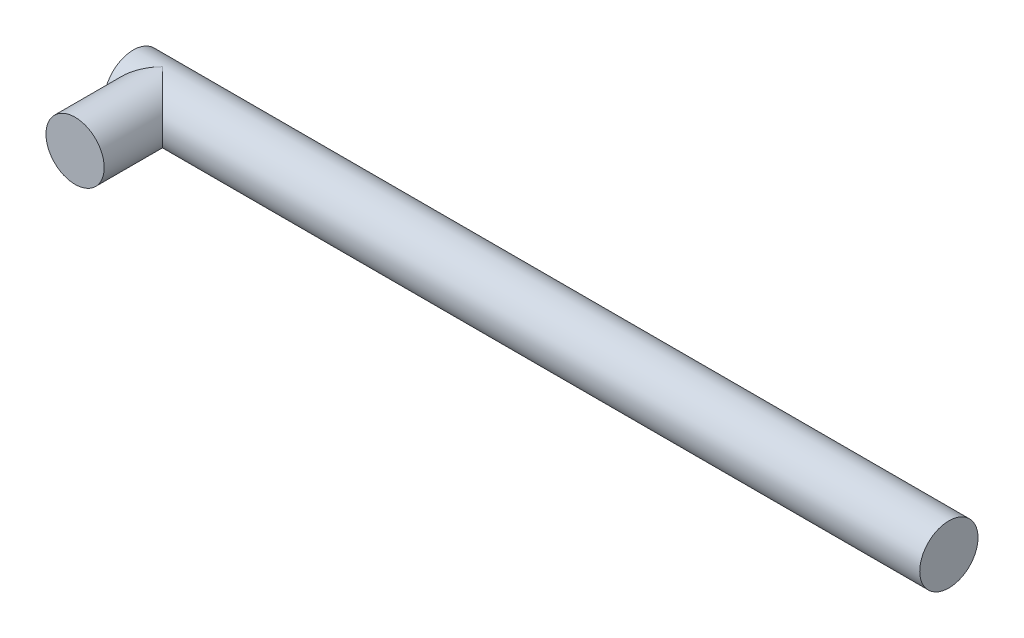
ISO-10303-21;
HEADER;
FILE_DESCRIPTION(('STEP AP214'),'2;1');
FILE_NAME('part.step','',(''),(''),'','','');
FILE_SCHEMA(('AUTOMOTIVE_DESIGN { 1 0 10303 214 1 1 1 1 }'));
ENDSEC;
DATA;
#1=APPLICATION_CONTEXT('core data for automotive mechanical design processes');
#2=APPLICATION_PROTOCOL_DEFINITION('international standard','automotive_design',2000,#1);
#3=PRODUCT_CONTEXT('',#1,'mechanical');
#4=PRODUCT('Part','Part','',(#3));
#5=PRODUCT_RELATED_PRODUCT_CATEGORY('part','',(#4));
#6=PRODUCT_DEFINITION_FORMATION('','',#4);
#7=PRODUCT_DEFINITION_CONTEXT('part definition',#1,'design');
#8=PRODUCT_DEFINITION('design','',#6,#7);
#9=PRODUCT_DEFINITION_SHAPE('','',#8);
#10=(LENGTH_UNIT() NAMED_UNIT(*) SI_UNIT(.MILLI.,.METRE.));
#11=(NAMED_UNIT(*) PLANE_ANGLE_UNIT() SI_UNIT($,.RADIAN.));
#12=(NAMED_UNIT(*) SI_UNIT($,.STERADIAN.) SOLID_ANGLE_UNIT());
#13=UNCERTAINTY_MEASURE_WITH_UNIT(LENGTH_MEASURE(1.E-05),#10,'distance_accuracy_value','');
#14=(GEOMETRIC_REPRESENTATION_CONTEXT(3) GLOBAL_UNCERTAINTY_ASSIGNED_CONTEXT((#13)) GLOBAL_UNIT_ASSIGNED_CONTEXT((#10,
#11,#12)) REPRESENTATION_CONTEXT('',''));
#15=CARTESIAN_POINT('',(0.,0.,0.));
#16=DIRECTION('',(0.,0.,1.));
#17=DIRECTION('',(1.,0.,0.));
#18=AXIS2_PLACEMENT_3D('',#15,#16,#17);
#19=CARTESIAN_POINT('',(7000.,0.,0.));
#20=DIRECTION('',(-1.,0.,0.));
#21=DIRECTION('',(0.,0.,1.));
#22=AXIS2_PLACEMENT_3D('',#19,#20,#21);
#23=CYLINDRICAL_SURFACE('',#22,250.);
#24=CARTESIAN_POINT('',(7000.,0.,0.));
#25=DIRECTION('',(1.,0.,0.));
#26=DIRECTION('',(0.,0.,-1.));
#27=AXIS2_PLACEMENT_3D('',#24,#25,#26);
#28=CIRCLE('',#27,250.);
#29=CARTESIAN_POINT('',(7000.,0.,-250.));
#30=VERTEX_POINT('',#29);
#31=EDGE_CURVE('E11',#30,#30,#28,.T.);
#32=ORIENTED_EDGE('',*,*,#31,.F.);
#33=EDGE_LOOP('',(#32));
#34=FACE_BOUND('',#33,.T.);
#35=CARTESIAN_POINT('',(250.,0.,0.));
#36=DIRECTION('',(-0.707106781186547,0.,-0.707106781186547));
#37=DIRECTION('',(-0.707106781186547,0.,0.707106781186547));
#38=AXIS2_PLACEMENT_3D('',#35,#36,#37);
#39=ELLIPSE('',#38,353.553390593274,250.);
#40=CARTESIAN_POINT('',(250.,250.,0.));
#41=VERTEX_POINT('',#40);
#42=CARTESIAN_POINT('',(0.,0.,250.));
#43=VERTEX_POINT('',#42);
#44=EDGE_CURVE('E61',#41,#43,#39,.F.);
#45=ORIENTED_EDGE('',*,*,#44,.F.);
#46=CARTESIAN_POINT('',(250.,0.,0.));
#47=DIRECTION('',(-0.707106781186547,0.,0.707106781186547));
#48=DIRECTION('',(-0.707106781186547,0.,-0.707106781186547));
#49=AXIS2_PLACEMENT_3D('',#46,#47,#48);
#50=ELLIPSE('',#49,353.553390593274,250.);
#51=CARTESIAN_POINT('',(250.,-250.,0.));
#52=VERTEX_POINT('',#51);
#53=EDGE_CURVE('E54',#52,#41,#50,.T.);
#54=ORIENTED_EDGE('',*,*,#53,.F.);
#55=EDGE_CURVE('E58',#43,#52,#39,.F.);
#56=ORIENTED_EDGE('',*,*,#55,.F.);
#57=CARTESIAN_POINT('',(0.,0.,0.));
#58=DIRECTION('',(1.,0.,0.));
#59=DIRECTION('',(0.,0.,-1.));
#60=AXIS2_PLACEMENT_3D('',#57,#58,#59);
#61=CIRCLE('',#60,250.);
#62=EDGE_CURVE('E42',#43,#43,#61,.T.);
#63=ORIENTED_EDGE('',*,*,#62,.T.);
#64=EDGE_LOOP('',(#45,#54,#56,#63));
#65=FACE_BOUND('',#64,.T.);
#66=ADVANCED_FACE('F39',(#34,#65),#23,.T.);
#67=CARTESIAN_POINT('',(7000.,0.,0.));
#68=DIRECTION('',(1.,0.,0.));
#69=DIRECTION('',(0.,0.,-1.));
#70=AXIS2_PLACEMENT_3D('',#67,#68,#69);
#71=PLANE('',#70);
#72=ORIENTED_EDGE('',*,*,#31,.T.);
#73=EDGE_LOOP('',(#72));
#74=FACE_BOUND('',#73,.T.);
#75=ADVANCED_FACE('F86',(#74),#71,.T.);
#76=CARTESIAN_POINT('',(0.,0.,0.));
#77=DIRECTION('',(1.,0.,0.));
#78=DIRECTION('',(0.,0.,-1.));
#79=AXIS2_PLACEMENT_3D('',#76,#77,#78);
#80=PLANE('',#79);
#81=ORIENTED_EDGE('',*,*,#62,.F.);
#82=EDGE_LOOP('',(#81));
#83=FACE_BOUND('',#82,.T.);
#84=ADVANCED_FACE('F79',(#83),#80,.F.);
#85=CARTESIAN_POINT('',(250.,0.,750.));
#86=DIRECTION('',(0.,0.,-1.));
#87=DIRECTION('',(-1.,0.,0.));
#88=AXIS2_PLACEMENT_3D('',#85,#86,#87);
#89=CYLINDRICAL_SURFACE('',#88,250.);
#90=CARTESIAN_POINT('',(250.,0.,750.));
#91=DIRECTION('',(0.,0.,1.));
#92=DIRECTION('',(1.,0.,0.));
#93=AXIS2_PLACEMENT_3D('',#90,#91,#92);
#94=CIRCLE('',#93,250.);
#95=CARTESIAN_POINT('',(500.,0.,750.));
#96=VERTEX_POINT('',#95);
#97=EDGE_CURVE('E70',#96,#96,#94,.T.);
#98=ORIENTED_EDGE('',*,*,#97,.F.);
#99=EDGE_LOOP('',(#98));
#100=FACE_BOUND('',#99,.T.);
#101=ORIENTED_EDGE('',*,*,#53,.T.);
#102=ORIENTED_EDGE('',*,*,#44,.T.);
#103=ORIENTED_EDGE('',*,*,#55,.T.);
#104=EDGE_LOOP('',(#101,#102,#103));
#105=FACE_BOUND('',#104,.T.);
#106=ADVANCED_FACE('F66',(#100,#105),#89,.T.);
#107=CARTESIAN_POINT('',(250.,0.,750.));
#108=DIRECTION('',(0.,0.,1.));
#109=DIRECTION('',(1.,0.,0.));
#110=AXIS2_PLACEMENT_3D('',#107,#108,#109);
#111=PLANE('',#110);
#112=ORIENTED_EDGE('',*,*,#97,.T.);
#113=EDGE_LOOP('',(#112));
#114=FACE_BOUND('',#113,.T.);
#115=ADVANCED_FACE('F76',(#114),#111,.T.);
#116=CLOSED_SHELL('',(#66,#75,#84,#106,#115));
#117=MANIFOLD_SOLID_BREP('B2',#116);
#118=ADVANCED_BREP_SHAPE_REPRESENTATION('',(#18,#117),#14);
#119=SHAPE_DEFINITION_REPRESENTATION(#9,#118);
ENDSEC;
END-ISO-10303-21;
